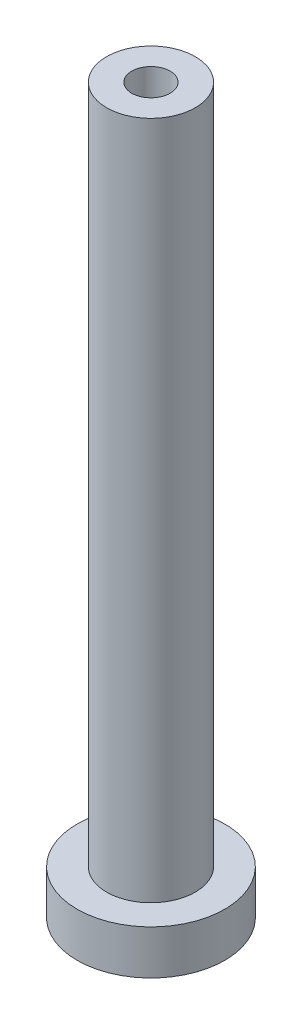
ISO-10303-21;
HEADER;
FILE_DESCRIPTION(('STEP AP214'),'2;1');
FILE_NAME('part.step','',(''),(''),'','','');
FILE_SCHEMA(('AUTOMOTIVE_DESIGN { 1 0 10303 214 1 1 1 1 }'));
ENDSEC;
DATA;
#1=APPLICATION_CONTEXT('core data for automotive mechanical design processes');
#2=APPLICATION_PROTOCOL_DEFINITION('international standard','automotive_design',2000,#1);
#3=PRODUCT_CONTEXT('',#1,'mechanical');
#4=PRODUCT('Part','Part','',(#3));
#5=PRODUCT_RELATED_PRODUCT_CATEGORY('part','',(#4));
#6=PRODUCT_DEFINITION_FORMATION('','',#4);
#7=PRODUCT_DEFINITION_CONTEXT('part definition',#1,'design');
#8=PRODUCT_DEFINITION('design','',#6,#7);
#9=PRODUCT_DEFINITION_SHAPE('','',#8);
#10=(LENGTH_UNIT() NAMED_UNIT(*) SI_UNIT(.MILLI.,.METRE.));
#11=(NAMED_UNIT(*) PLANE_ANGLE_UNIT() SI_UNIT($,.RADIAN.));
#12=(NAMED_UNIT(*) SI_UNIT($,.STERADIAN.) SOLID_ANGLE_UNIT());
#13=UNCERTAINTY_MEASURE_WITH_UNIT(LENGTH_MEASURE(1.E-05),#10,'distance_accuracy_value','');
#14=(GEOMETRIC_REPRESENTATION_CONTEXT(3) GLOBAL_UNCERTAINTY_ASSIGNED_CONTEXT((#13)) GLOBAL_UNIT_ASSIGNED_CONTEXT((#10,
#11,#12)) REPRESENTATION_CONTEXT('',''));
#15=CARTESIAN_POINT('',(0.,0.,0.));
#16=DIRECTION('',(0.,0.,1.));
#17=DIRECTION('',(1.,0.,0.));
#18=AXIS2_PLACEMENT_3D('',#15,#16,#17);
#19=CARTESIAN_POINT('',(0.,0.,-2.5));
#20=DIRECTION('',(0.,-1.,0.));
#21=DIRECTION('',(0.,0.,-1.));
#22=AXIS2_PLACEMENT_3D('',#19,#20,#21);
#23=PLANE('',#22);
#24=CARTESIAN_POINT('',(0.,0.,-2.5));
#25=DIRECTION('',(0.,1.,0.));
#26=DIRECTION('',(0.,0.,1.));
#27=AXIS2_PLACEMENT_3D('',#24,#25,#26);
#28=CIRCLE('',#27,2.5);
#29=CARTESIAN_POINT('',(0.,0.,0.));
#30=VERTEX_POINT('',#29);
#31=EDGE_CURVE('E10',#30,#30,#28,.T.);
#32=ORIENTED_EDGE('',*,*,#31,.F.);
#33=EDGE_LOOP('',(#32));
#34=FACE_BOUND('',#33,.T.);
#35=ADVANCED_FACE('F41',(#34),#23,.T.);
#36=CARTESIAN_POINT('',(0.,16.5,-2.5));
#37=DIRECTION('',(0.,1.,0.));
#38=DIRECTION('',(0.,0.,1.));
#39=AXIS2_PLACEMENT_3D('',#36,#37,#38);
#40=CYLINDRICAL_SURFACE('',#39,2.5);
#41=ORIENTED_EDGE('',*,*,#31,.T.);
#42=EDGE_LOOP('',(#41));
#43=FACE_BOUND('',#42,.T.);
#44=CARTESIAN_POINT('',(0.,1.5,-2.5));
#45=DIRECTION('',(0.,1.,0.));
#46=DIRECTION('',(0.,0.,1.));
#47=AXIS2_PLACEMENT_3D('',#44,#45,#46);
#48=CIRCLE('',#47,2.5);
#49=CARTESIAN_POINT('',(0.,1.5,0.));
#50=VERTEX_POINT('',#49);
#51=EDGE_CURVE('E48',#50,#50,#48,.T.);
#52=ORIENTED_EDGE('',*,*,#51,.F.);
#53=EDGE_LOOP('',(#52));
#54=FACE_BOUND('',#53,.T.);
#55=ADVANCED_FACE('F89',(#43,#54),#40,.T.);
#56=CARTESIAN_POINT('',(0.,1.5,0.));
#57=DIRECTION('',(0.,1.,0.));
#58=DIRECTION('',(0.,0.,1.));
#59=AXIS2_PLACEMENT_3D('',#56,#57,#58);
#60=PLANE('',#59);
#61=ORIENTED_EDGE('',*,*,#51,.T.);
#62=EDGE_LOOP('',(#61));
#63=FACE_BOUND('',#62,.T.);
#64=CARTESIAN_POINT('',(0.,1.5,-2.5));
#65=DIRECTION('',(0.,1.,0.));
#66=DIRECTION('',(0.,0.,1.));
#67=AXIS2_PLACEMENT_3D('',#64,#65,#66);
#68=CIRCLE('',#67,1.5);
#69=CARTESIAN_POINT('',(0.,1.5,-1.));
#70=VERTEX_POINT('',#69);
#71=EDGE_CURVE('E53',#70,#70,#68,.T.);
#72=ORIENTED_EDGE('',*,*,#71,.F.);
#73=EDGE_LOOP('',(#72));
#74=FACE_BOUND('',#73,.T.);
#75=ADVANCED_FACE('F94',(#63,#74),#60,.T.);
#76=CARTESIAN_POINT('',(0.,16.5,-2.5));
#77=DIRECTION('',(0.,1.,0.));
#78=DIRECTION('',(0.,0.,1.));
#79=AXIS2_PLACEMENT_3D('',#76,#77,#78);
#80=CYLINDRICAL_SURFACE('',#79,1.5);
#81=ORIENTED_EDGE('',*,*,#71,.T.);
#82=EDGE_LOOP('',(#81));
#83=FACE_BOUND('',#82,.T.);
#84=CARTESIAN_POINT('',(0.,24.5,-2.5));
#85=DIRECTION('',(0.,1.,0.));
#86=DIRECTION('',(0.,0.,1.));
#87=AXIS2_PLACEMENT_3D('',#84,#85,#86);
#88=CIRCLE('',#87,1.5);
#89=CARTESIAN_POINT('',(0.,24.5,-1.));
#90=VERTEX_POINT('',#89);
#91=EDGE_CURVE('E58',#90,#90,#88,.T.);
#92=ORIENTED_EDGE('',*,*,#91,.F.);
#93=EDGE_LOOP('',(#92));
#94=FACE_BOUND('',#93,.T.);
#95=ADVANCED_FACE('F85',(#83,#94),#80,.T.);
#96=CARTESIAN_POINT('',(0.,24.5,-1.));
#97=DIRECTION('',(0.,1.,0.));
#98=DIRECTION('',(0.,0.,1.));
#99=AXIS2_PLACEMENT_3D('',#96,#97,#98);
#100=PLANE('',#99);
#101=ORIENTED_EDGE('',*,*,#91,.T.);
#102=EDGE_LOOP('',(#101));
#103=FACE_BOUND('',#102,.T.);
#104=CARTESIAN_POINT('',(0.,24.5,-2.5));
#105=DIRECTION('',(0.,1.,0.));
#106=DIRECTION('',(0.,0.,1.));
#107=AXIS2_PLACEMENT_3D('',#104,#105,#106);
#108=CIRCLE('',#107,0.65);
#109=CARTESIAN_POINT('',(0.,24.5,-1.85));
#110=VERTEX_POINT('',#109);
#111=EDGE_CURVE('E64',#110,#110,#108,.T.);
#112=ORIENTED_EDGE('',*,*,#111,.F.);
#113=EDGE_LOOP('',(#112));
#114=FACE_BOUND('',#113,.T.);
#115=ADVANCED_FACE('F77',(#103,#114),#100,.T.);
#116=CARTESIAN_POINT('',(0.,16.5,-2.5));
#117=DIRECTION('',(0.,1.,0.));
#118=DIRECTION('',(0.,0.,1.));
#119=AXIS2_PLACEMENT_3D('',#116,#117,#118);
#120=CYLINDRICAL_SURFACE('',#119,0.65);
#121=ORIENTED_EDGE('',*,*,#111,.T.);
#122=EDGE_LOOP('',(#121));
#123=FACE_BOUND('',#122,.T.);
#124=CARTESIAN_POINT('',(0.,16.5,-2.5));
#125=DIRECTION('',(0.,1.,0.));
#126=DIRECTION('',(0.,0.,1.));
#127=AXIS2_PLACEMENT_3D('',#124,#125,#126);
#128=CIRCLE('',#127,0.65);
#129=CARTESIAN_POINT('',(0.,16.5,-1.85));
#130=VERTEX_POINT('',#129);
#131=EDGE_CURVE('E68',#130,#130,#128,.T.);
#132=ORIENTED_EDGE('',*,*,#131,.F.);
#133=EDGE_LOOP('',(#132));
#134=FACE_BOUND('',#133,.T.);
#135=ADVANCED_FACE('F75',(#123,#134),#120,.F.);
#136=CARTESIAN_POINT('',(0.,16.5,-1.85));
#137=DIRECTION('',(0.,1.,0.));
#138=DIRECTION('',(0.,0.,1.));
#139=AXIS2_PLACEMENT_3D('',#136,#137,#138);
#140=PLANE('',#139);
#141=ORIENTED_EDGE('',*,*,#131,.T.);
#142=EDGE_LOOP('',(#141));
#143=FACE_BOUND('',#142,.T.);
#144=ADVANCED_FACE('F73',(#143),#140,.T.);
#145=CLOSED_SHELL('',(#35,#55,#75,#95,#115,#135,#144));
#146=MANIFOLD_SOLID_BREP('B2',#145);
#147=ADVANCED_BREP_SHAPE_REPRESENTATION('',(#18,#146),#14);
#148=SHAPE_DEFINITION_REPRESENTATION(#9,#147);
ENDSEC;
END-ISO-10303-21;
